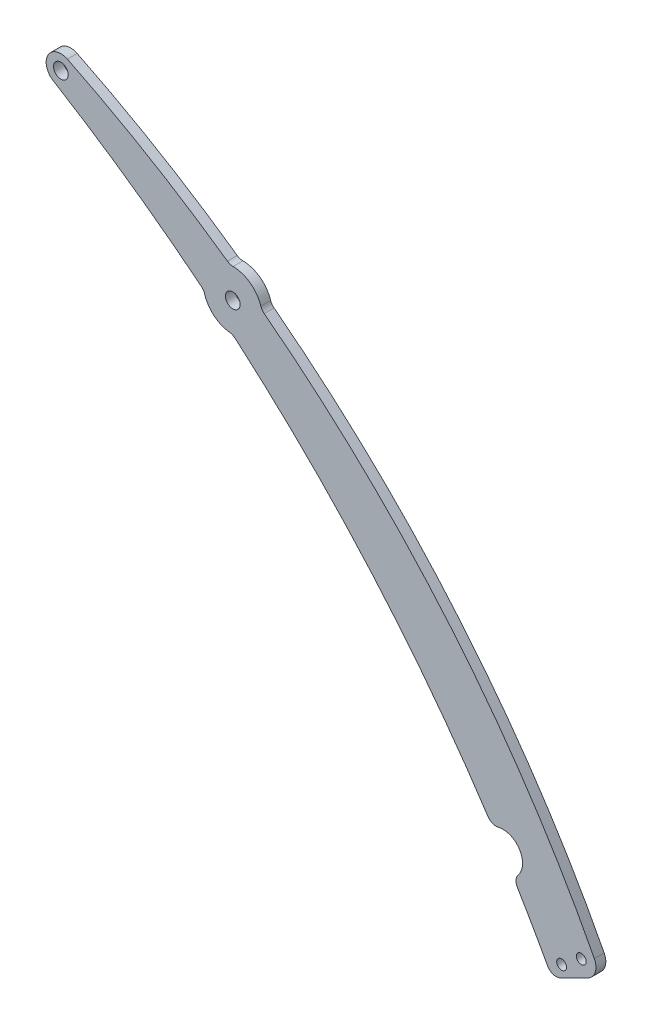
ISO-10303-21;
HEADER;
FILE_DESCRIPTION(('STEP AP214'),'2;1');
FILE_NAME('part.step','',(''),(''),'','','');
FILE_SCHEMA(('AUTOMOTIVE_DESIGN { 1 0 10303 214 1 1 1 1 }'));
ENDSEC;
DATA;
#1=APPLICATION_CONTEXT('core data for automotive mechanical design processes');
#2=APPLICATION_PROTOCOL_DEFINITION('international standard','automotive_design',2000,#1);
#3=PRODUCT_CONTEXT('',#1,'mechanical');
#4=PRODUCT('Part','Part','',(#3));
#5=PRODUCT_RELATED_PRODUCT_CATEGORY('part','',(#4));
#6=PRODUCT_DEFINITION_FORMATION('','',#4);
#7=PRODUCT_DEFINITION_CONTEXT('part definition',#1,'design');
#8=PRODUCT_DEFINITION('design','',#6,#7);
#9=PRODUCT_DEFINITION_SHAPE('','',#8);
#10=(LENGTH_UNIT() NAMED_UNIT(*) SI_UNIT(.MILLI.,.METRE.));
#11=(NAMED_UNIT(*) PLANE_ANGLE_UNIT() SI_UNIT($,.RADIAN.));
#12=(NAMED_UNIT(*) SI_UNIT($,.STERADIAN.) SOLID_ANGLE_UNIT());
#13=UNCERTAINTY_MEASURE_WITH_UNIT(LENGTH_MEASURE(1.E-05),#10,'distance_accuracy_value','');
#14=(GEOMETRIC_REPRESENTATION_CONTEXT(3) GLOBAL_UNCERTAINTY_ASSIGNED_CONTEXT((#13)) GLOBAL_UNIT_ASSIGNED_CONTEXT((#10,
#11,#12)) REPRESENTATION_CONTEXT('',''));
#15=CARTESIAN_POINT('',(0.,0.,0.));
#16=DIRECTION('',(0.,0.,1.));
#17=DIRECTION('',(1.,0.,0.));
#18=AXIS2_PLACEMENT_3D('',#15,#16,#17);
#19=CARTESIAN_POINT('',(-104.441646141028,-212.746192801075,2.));
#20=DIRECTION('',(0.,0.,-1.));
#21=DIRECTION('',(-1.,0.,0.));
#22=AXIS2_PLACEMENT_3D('',#19,#20,#21);
#23=PLANE('',#22);
#24=CARTESIAN_POINT('',(-104.441646141028,-212.746192801075,2.));
#25=DIRECTION('',(0.,0.,1.));
#26=DIRECTION('',(-1.,0.,0.));
#27=AXIS2_PLACEMENT_3D('',#24,#25,#26);
#28=CIRCLE('',#27,240.);
#29=CARTESIAN_POINT('',(33.906457746994,-16.6344844545589,2.));
#30=VERTEX_POINT('',#29);
#31=CARTESIAN_POINT('',(1.32204615368389,2.69298978229209,2.));
#32=VERTEX_POINT('',#31);
#33=EDGE_CURVE('E226',#30,#32,#28,.T.);
#34=ORIENTED_EDGE('',*,*,#33,.T.);
#35=CARTESIAN_POINT('',(0.,0.,2.));
#36=DIRECTION('',(0.,0.,1.));
#37=DIRECTION('',(1.,0.,0.));
#38=AXIS2_PLACEMENT_3D('',#35,#36,#37);
#39=CIRCLE('',#38,3.);
#40=CARTESIAN_POINT('',(-1.55871058061747,-2.56328330971649,2.));
#41=VERTEX_POINT('',#40);
#42=EDGE_CURVE('E124',#32,#41,#39,.T.);
#43=ORIENTED_EDGE('',*,*,#42,.T.);
#44=CARTESIAN_POINT('',(-147.038364771582,-241.803058883256,2.));
#45=DIRECTION('',(0.,0.,-1.));
#46=DIRECTION('',(-1.,0.,0.));
#47=AXIS2_PLACEMENT_3D('',#44,#45,#46);
#48=CIRCLE('',#47,280.);
#49=CARTESIAN_POINT('',(28.589143834394,-23.7320194927445,2.));
#50=VERTEX_POINT('',#49);
#51=EDGE_CURVE('E271',#41,#50,#48,.T.);
#52=ORIENTED_EDGE('',*,*,#51,.T.);
#53=CARTESIAN_POINT('',(27.3346616300656,-25.2896697741052,2.));
#54=DIRECTION('',(0.,0.,-1.));
#55=DIRECTION('',(-1.,0.,0.));
#56=AXIS2_PLACEMENT_3D('',#53,#54,#55);
#57=CIRCLE('',#56,2.);
#58=CARTESIAN_POINT('',(29.2509962225486,-24.7172523305791,2.));
#59=VERTEX_POINT('',#58);
#60=EDGE_CURVE('E290',#50,#59,#57,.T.);
#61=ORIENTED_EDGE('',*,*,#60,.T.);
#62=CARTESIAN_POINT('',(35.,-23.,2.));
#63=DIRECTION('',(0.,0.,1.));
#64=DIRECTION('',(1.,0.,0.));
#65=AXIS2_PLACEMENT_3D('',#62,#63,#64);
#66=CIRCLE('',#65,6.00000000000246);
#67=CARTESIAN_POINT('',(34.3571848035066,-28.9654663374448,2.));
#68=VERTEX_POINT('',#67);
#69=EDGE_CURVE('E287',#59,#68,#66,.T.);
#70=ORIENTED_EDGE('',*,*,#69,.T.);
#71=CARTESIAN_POINT('',(34.1429130713422,-30.9539551165922,2.));
#72=DIRECTION('',(0.,0.,-1.));
#73=DIRECTION('',(1.,0.,0.));
#74=AXIS2_PLACEMENT_3D('',#71,#72,#73);
#75=CIRCLE('',#74,2.);
#76=CARTESIAN_POINT('',(35.4463755018668,-29.4370550894939,2.));
#77=VERTEX_POINT('',#76);
#78=EDGE_CURVE('E289',#68,#77,#75,.T.);
#79=ORIENTED_EDGE('',*,*,#78,.T.);
#80=CARTESIAN_POINT('',(-147.038364771582,-241.803058883256,2.));
#81=DIRECTION('',(0.,0.,-1.));
#82=DIRECTION('',(-1.,0.,0.));
#83=AXIS2_PLACEMENT_3D('',#80,#81,#82);
#84=CIRCLE('',#83,280.);
#85=CARTESIAN_POINT('',(86.9517610214961,-88.0219773701524,2.));
#86=VERTEX_POINT('',#85);
#87=EDGE_CURVE('E292',#77,#86,#84,.T.);
#88=ORIENTED_EDGE('',*,*,#87,.T.);
#89=CARTESIAN_POINT('',(88.6231190628752,-86.9235410736303,2.));
#90=DIRECTION('',(0.,0.,1.));
#91=DIRECTION('',(-1.,0.,0.));
#92=AXIS2_PLACEMENT_3D('',#89,#90,#91);
#93=CIRCLE('',#92,2.);
#94=CARTESIAN_POINT('',(89.0820793752501,-88.8701677537271,2.));
#95=VERTEX_POINT('',#94);
#96=EDGE_CURVE('E298',#86,#95,#93,.T.);
#97=ORIENTED_EDGE('',*,*,#96,.T.);
#98=CARTESIAN_POINT('',(90.,-92.7634211139207,2.));
#99=DIRECTION('',(0.,0.,-1.));
#100=DIRECTION('',(-1.,0.,0.));
#101=AXIS2_PLACEMENT_3D('',#98,#99,#100);
#102=CIRCLE('',#101,3.99999999999999);
#103=CARTESIAN_POINT('',(93.1109286253578,-95.2778043559762,2.));
#104=VERTEX_POINT('',#103);
#105=EDGE_CURVE('E300',#95,#104,#102,.T.);
#106=ORIENTED_EDGE('',*,*,#105,.T.);
#107=CARTESIAN_POINT('',(94.6663929380367,-96.5349959770039,2.));
#108=DIRECTION('',(0.,0.,1.));
#109=DIRECTION('',(1.,0.,0.));
#110=AXIS2_PLACEMENT_3D('',#107,#108,#109);
#111=CIRCLE('',#110,2.);
#112=CARTESIAN_POINT('',(92.9521747982521,-97.5652659266937,2.));
#113=VERTEX_POINT('',#112);
#114=EDGE_CURVE('E302',#104,#113,#111,.T.);
#115=ORIENTED_EDGE('',*,*,#114,.T.);
#116=CARTESIAN_POINT('',(-147.038364771582,-241.803058883256,2.));
#117=DIRECTION('',(0.,0.,-1.));
#118=DIRECTION('',(-1.,0.,0.));
#119=AXIS2_PLACEMENT_3D('',#116,#117,#118);
#120=CIRCLE('',#119,280.);
#121=CARTESIAN_POINT('',(99.0817764541614,-108.293223728611,2.));
#122=VERTEX_POINT('',#121);
#123=EDGE_CURVE('E304',#113,#122,#120,.T.);
#124=ORIENTED_EDGE('',*,*,#123,.T.);
#125=CARTESIAN_POINT('',(100.839777462917,-107.339582048935,2.));
#126=DIRECTION('',(0.,0.,1.));
#127=DIRECTION('',(1.,0.,0.));
#128=AXIS2_PLACEMENT_3D('',#125,#126,#127);
#129=CIRCLE('',#128,1.99999999999999);
#130=CARTESIAN_POINT('',(101.737876551127,-109.126595766777,2.));
#131=VERTEX_POINT('',#130);
#132=EDGE_CURVE('E306',#122,#131,#129,.T.);
#133=ORIENTED_EDGE('',*,*,#132,.T.);
#134=DIRECTION('',(0.893506858920948,0.449049544105348,0.));
#135=VECTOR('',#134,1.);
#136=CARTESIAN_POINT('',(107.302513423485,-106.329977446844,2.));
#137=LINE('',#136,#135);
#138=CARTESIAN_POINT('',(107.302513423485,-106.329977446844,2.));
#139=VERTEX_POINT('',#138);
#140=EDGE_CURVE('E308',#131,#139,#137,.T.);
#141=ORIENTED_EDGE('',*,*,#140,.T.);
#142=CARTESIAN_POINT('',(105.955364791169,-103.649456870081,2.));
#143=DIRECTION('',(0.,0.,1.));
#144=DIRECTION('',(-1.,0.,0.));
#145=AXIS2_PLACEMENT_3D('',#142,#143,#144);
#146=CIRCLE('',#145,2.99999999999999);
#147=CARTESIAN_POINT('',(108.618618094108,-102.268485529183,2.));
#148=VERTEX_POINT('',#147);
#149=EDGE_CURVE('E310',#139,#148,#146,.T.);
#150=ORIENTED_EDGE('',*,*,#149,.T.);
#151=CARTESIAN_POINT('',(-104.441646141028,-212.746192801075,2.));
#152=DIRECTION('',(0.,0.,1.));
#153=DIRECTION('',(-1.,0.,0.));
#154=AXIS2_PLACEMENT_3D('',#151,#152,#153);
#155=CIRCLE('',#154,240.);
#156=CARTESIAN_POINT('',(41.4015934450764,-22.1425478542113,2.));
#157=VERTEX_POINT('',#156);
#158=EDGE_CURVE('E173',#148,#157,#155,.T.);
#159=ORIENTED_EDGE('',*,*,#158,.T.);
#160=CARTESIAN_POINT('',(42.6169537749606,-20.5541841463207,2.));
#161=DIRECTION('',(0.,0.,-1.));
#162=DIRECTION('',(-1.,0.,0.));
#163=AXIS2_PLACEMENT_3D('',#160,#161,#162);
#164=CIRCLE('',#163,2.);
#165=CARTESIAN_POINT('',(40.7127153312204,-21.1656381097406,2.));
#166=VERTEX_POINT('',#165);
#167=EDGE_CURVE('E167',#157,#166,#164,.T.);
#168=ORIENTED_EDGE('',*,*,#167,.T.);
#169=CARTESIAN_POINT('',(35.,-23.,2.));
#170=DIRECTION('',(0.,0.,1.));
#171=DIRECTION('',(1.,0.,0.));
#172=AXIS2_PLACEMENT_3D('',#169,#170,#171);
#173=CIRCLE('',#172,5.99999999999969);
#174=CARTESIAN_POINT('',(35.0445189595456,-17.0001651637535,2.));
#175=VERTEX_POINT('',#174);
#176=EDGE_CURVE('E171',#166,#175,#173,.T.);
#177=ORIENTED_EDGE('',*,*,#176,.T.);
#178=CARTESIAN_POINT('',(35.0593586127275,-15.0002202183379,2.));
#179=DIRECTION('',(0.,0.,-1.));
#180=DIRECTION('',(1.,0.,0.));
#181=AXIS2_PLACEMENT_3D('',#178,#179,#180);
#182=CIRCLE('',#181,2.);
#183=EDGE_CURVE('E51',#175,#30,#182,.T.);
#184=ORIENTED_EDGE('',*,*,#183,.T.);
#185=EDGE_LOOP('',(#34,#43,#52,#61,#70,#79,#88,#97,#106,#115,#124,#133,#141,#150,#159,#168,#177,#184));
#186=FACE_BOUND('',#185,.T.);
#187=CARTESIAN_POINT('',(0.,0.,2.));
#188=DIRECTION('',(0.,0.,1.));
#189=DIRECTION('',(1.,0.,0.));
#190=AXIS2_PLACEMENT_3D('',#187,#188,#189);
#191=CIRCLE('',#190,1.5);
#192=CARTESIAN_POINT('',(1.5,0.,2.));
#193=VERTEX_POINT('',#192);
#194=EDGE_CURVE('E195',#193,#193,#191,.T.);
#195=ORIENTED_EDGE('',*,*,#194,.F.);
#196=EDGE_LOOP('',(#195));
#197=FACE_BOUND('',#196,.T.);
#198=CARTESIAN_POINT('',(101.955364791169,-106.649456870081,2.));
#199=DIRECTION('',(0.,0.,1.));
#200=DIRECTION('',(1.,0.,0.));
#201=AXIS2_PLACEMENT_3D('',#198,#199,#200);
#202=CIRCLE('',#201,0.999999999999998);
#203=CARTESIAN_POINT('',(102.955364791169,-106.649456870081,2.));
#204=VERTEX_POINT('',#203);
#205=EDGE_CURVE('E374',#204,#204,#202,.T.);
#206=ORIENTED_EDGE('',*,*,#205,.F.);
#207=EDGE_LOOP('',(#206));
#208=FACE_BOUND('',#207,.T.);
#209=CARTESIAN_POINT('',(35.,-23.,2.));
#210=DIRECTION('',(0.,0.,1.));
#211=DIRECTION('',(1.,0.,0.));
#212=AXIS2_PLACEMENT_3D('',#209,#210,#211);
#213=CIRCLE('',#212,1.5);
#214=CARTESIAN_POINT('',(36.5,-23.,2.));
#215=VERTEX_POINT('',#214);
#216=EDGE_CURVE('E368',#215,#215,#213,.T.);
#217=ORIENTED_EDGE('',*,*,#216,.F.);
#218=EDGE_LOOP('',(#217));
#219=FACE_BOUND('',#218,.T.);
#220=CARTESIAN_POINT('',(105.955364791169,-103.649456870081,2.));
#221=DIRECTION('',(0.,0.,1.));
#222=DIRECTION('',(1.,0.,0.));
#223=AXIS2_PLACEMENT_3D('',#220,#221,#222);
#224=CIRCLE('',#223,0.999999999999998);
#225=CARTESIAN_POINT('',(106.955364791169,-103.649456870081,2.));
#226=VERTEX_POINT('',#225);
#227=EDGE_CURVE('E359',#226,#226,#224,.T.);
#228=ORIENTED_EDGE('',*,*,#227,.F.);
#229=EDGE_LOOP('',(#228));
#230=FACE_BOUND('',#229,.T.);
#231=ADVANCED_FACE('F34',(#186,#197,#208,#219,#230),#23,.F.);
#232=CARTESIAN_POINT('',(-104.441646141028,-212.746192801075,0.));
#233=DIRECTION('',(0.,0.,-1.));
#234=DIRECTION('',(-1.,0.,0.));
#235=AXIS2_PLACEMENT_3D('',#232,#233,#234);
#236=PLANE('',#235);
#237=CARTESIAN_POINT('',(35.,-23.,0.));
#238=DIRECTION('',(0.,0.,1.));
#239=DIRECTION('',(1.,0.,0.));
#240=AXIS2_PLACEMENT_3D('',#237,#238,#239);
#241=CIRCLE('',#240,1.5);
#242=CARTESIAN_POINT('',(36.5,-23.,0.));
#243=VERTEX_POINT('',#242);
#244=EDGE_CURVE('E365',#243,#243,#241,.T.);
#245=ORIENTED_EDGE('',*,*,#244,.T.);
#246=EDGE_LOOP('',(#245));
#247=FACE_BOUND('',#246,.T.);
#248=CARTESIAN_POINT('',(0.,0.,0.));
#249=DIRECTION('',(0.,0.,1.));
#250=DIRECTION('',(1.,0.,0.));
#251=AXIS2_PLACEMENT_3D('',#248,#249,#250);
#252=CIRCLE('',#251,1.5);
#253=CARTESIAN_POINT('',(1.5,0.,0.));
#254=VERTEX_POINT('',#253);
#255=EDGE_CURVE('E377',#254,#254,#252,.T.);
#256=ORIENTED_EDGE('',*,*,#255,.T.);
#257=EDGE_LOOP('',(#256));
#258=FACE_BOUND('',#257,.T.);
#259=CARTESIAN_POINT('',(-104.441646141028,-212.746192801075,0.));
#260=DIRECTION('',(0.,0.,1.));
#261=DIRECTION('',(-1.,0.,0.));
#262=AXIS2_PLACEMENT_3D('',#259,#260,#261);
#263=CIRCLE('',#262,240.);
#264=CARTESIAN_POINT('',(33.906457746994,-16.6344844545589,0.));
#265=VERTEX_POINT('',#264);
#266=CARTESIAN_POINT('',(1.32204615368389,2.69298978229209,0.));
#267=VERTEX_POINT('',#266);
#268=EDGE_CURVE('E191',#265,#267,#263,.T.);
#269=ORIENTED_EDGE('',*,*,#268,.F.);
#270=CARTESIAN_POINT('',(35.0593586127275,-15.0002202183379,0.));
#271=DIRECTION('',(0.,0.,-1.));
#272=DIRECTION('',(1.,0.,0.));
#273=AXIS2_PLACEMENT_3D('',#270,#271,#272);
#274=CIRCLE('',#273,2.);
#275=CARTESIAN_POINT('',(35.0445189595456,-17.0001651637535,0.));
#276=VERTEX_POINT('',#275);
#277=EDGE_CURVE('E116',#276,#265,#274,.T.);
#278=ORIENTED_EDGE('',*,*,#277,.F.);
#279=CARTESIAN_POINT('',(35.,-23.,0.));
#280=DIRECTION('',(0.,0.,1.));
#281=DIRECTION('',(1.,0.,0.));
#282=AXIS2_PLACEMENT_3D('',#279,#280,#281);
#283=CIRCLE('',#282,5.99999999999969);
#284=CARTESIAN_POINT('',(40.7127153312204,-21.1656381097406,0.));
#285=VERTEX_POINT('',#284);
#286=EDGE_CURVE('E110',#285,#276,#283,.T.);
#287=ORIENTED_EDGE('',*,*,#286,.F.);
#288=CARTESIAN_POINT('',(42.6169537749606,-20.5541841463207,0.));
#289=DIRECTION('',(0.,0.,-1.));
#290=DIRECTION('',(-1.,0.,0.));
#291=AXIS2_PLACEMENT_3D('',#288,#289,#290);
#292=CIRCLE('',#291,2.);
#293=CARTESIAN_POINT('',(41.4015934450764,-22.1425478542113,0.));
#294=VERTEX_POINT('',#293);
#295=EDGE_CURVE('E181',#294,#285,#292,.T.);
#296=ORIENTED_EDGE('',*,*,#295,.F.);
#297=CARTESIAN_POINT('',(-104.441646141028,-212.746192801075,0.));
#298=DIRECTION('',(0.,0.,1.));
#299=DIRECTION('',(-1.,0.,0.));
#300=AXIS2_PLACEMENT_3D('',#297,#298,#299);
#301=CIRCLE('',#300,240.);
#302=CARTESIAN_POINT('',(108.618618094108,-102.268485529183,0.));
#303=VERTEX_POINT('',#302);
#304=EDGE_CURVE('E221',#303,#294,#301,.T.);
#305=ORIENTED_EDGE('',*,*,#304,.F.);
#306=CARTESIAN_POINT('',(105.955364791169,-103.649456870081,0.));
#307=DIRECTION('',(0.,0.,1.));
#308=DIRECTION('',(-1.,0.,0.));
#309=AXIS2_PLACEMENT_3D('',#306,#307,#308);
#310=CIRCLE('',#309,2.99999999999999);
#311=CARTESIAN_POINT('',(107.302513423485,-106.329977446844,0.));
#312=VERTEX_POINT('',#311);
#313=EDGE_CURVE('E219',#312,#303,#310,.T.);
#314=ORIENTED_EDGE('',*,*,#313,.F.);
#315=DIRECTION('',(0.893506858920948,0.449049544105348,0.));
#316=VECTOR('',#315,1.);
#317=CARTESIAN_POINT('',(107.302513423485,-106.329977446844,0.));
#318=LINE('',#317,#316);
#319=CARTESIAN_POINT('',(101.737876551127,-109.126595766777,0.));
#320=VERTEX_POINT('',#319);
#321=EDGE_CURVE('E217',#320,#312,#318,.T.);
#322=ORIENTED_EDGE('',*,*,#321,.F.);
#323=CARTESIAN_POINT('',(100.839777462917,-107.339582048935,0.));
#324=DIRECTION('',(0.,0.,1.));
#325=DIRECTION('',(1.,0.,0.));
#326=AXIS2_PLACEMENT_3D('',#323,#324,#325);
#327=CIRCLE('',#326,1.99999999999999);
#328=CARTESIAN_POINT('',(99.0817764541614,-108.293223728611,0.));
#329=VERTEX_POINT('',#328);
#330=EDGE_CURVE('E215',#329,#320,#327,.T.);
#331=ORIENTED_EDGE('',*,*,#330,.F.);
#332=CARTESIAN_POINT('',(-147.038364771582,-241.803058883256,0.));
#333=DIRECTION('',(0.,0.,-1.));
#334=DIRECTION('',(-1.,0.,0.));
#335=AXIS2_PLACEMENT_3D('',#332,#333,#334);
#336=CIRCLE('',#335,280.);
#337=CARTESIAN_POINT('',(92.9521747982521,-97.5652659266937,0.));
#338=VERTEX_POINT('',#337);
#339=EDGE_CURVE('E213',#338,#329,#336,.T.);
#340=ORIENTED_EDGE('',*,*,#339,.F.);
#341=CARTESIAN_POINT('',(94.6663929380367,-96.5349959770039,0.));
#342=DIRECTION('',(0.,0.,1.));
#343=DIRECTION('',(1.,0.,0.));
#344=AXIS2_PLACEMENT_3D('',#341,#342,#343);
#345=CIRCLE('',#344,2.);
#346=CARTESIAN_POINT('',(93.1109286253578,-95.2778043559762,0.));
#347=VERTEX_POINT('',#346);
#348=EDGE_CURVE('E211',#347,#338,#345,.T.);
#349=ORIENTED_EDGE('',*,*,#348,.F.);
#350=CARTESIAN_POINT('',(90.,-92.7634211139207,0.));
#351=DIRECTION('',(0.,0.,-1.));
#352=DIRECTION('',(-1.,0.,0.));
#353=AXIS2_PLACEMENT_3D('',#350,#351,#352);
#354=CIRCLE('',#353,3.99999999999999);
#355=CARTESIAN_POINT('',(89.0820793752501,-88.8701677537271,0.));
#356=VERTEX_POINT('',#355);
#357=EDGE_CURVE('E209',#356,#347,#354,.T.);
#358=ORIENTED_EDGE('',*,*,#357,.F.);
#359=CARTESIAN_POINT('',(88.6231190628752,-86.9235410736303,0.));
#360=DIRECTION('',(0.,0.,1.));
#361=DIRECTION('',(-1.,0.,0.));
#362=AXIS2_PLACEMENT_3D('',#359,#360,#361);
#363=CIRCLE('',#362,2.);
#364=CARTESIAN_POINT('',(86.9517610214961,-88.0219773701524,0.));
#365=VERTEX_POINT('',#364);
#366=EDGE_CURVE('E207',#365,#356,#363,.T.);
#367=ORIENTED_EDGE('',*,*,#366,.F.);
#368=CARTESIAN_POINT('',(-147.038364771582,-241.803058883256,0.));
#369=DIRECTION('',(0.,0.,-1.));
#370=DIRECTION('',(-1.,0.,0.));
#371=AXIS2_PLACEMENT_3D('',#368,#369,#370);
#372=CIRCLE('',#371,280.);
#373=CARTESIAN_POINT('',(35.4463755018668,-29.4370550894939,0.));
#374=VERTEX_POINT('',#373);
#375=EDGE_CURVE('E205',#374,#365,#372,.T.);
#376=ORIENTED_EDGE('',*,*,#375,.F.);
#377=CARTESIAN_POINT('',(34.1429130713422,-30.9539551165922,0.));
#378=DIRECTION('',(0.,0.,-1.));
#379=DIRECTION('',(1.,0.,0.));
#380=AXIS2_PLACEMENT_3D('',#377,#378,#379);
#381=CIRCLE('',#380,2.);
#382=CARTESIAN_POINT('',(34.3571848035066,-28.9654663374448,0.));
#383=VERTEX_POINT('',#382);
#384=EDGE_CURVE('E203',#383,#374,#381,.T.);
#385=ORIENTED_EDGE('',*,*,#384,.F.);
#386=CARTESIAN_POINT('',(35.,-23.,0.));
#387=DIRECTION('',(0.,0.,1.));
#388=DIRECTION('',(1.,0.,0.));
#389=AXIS2_PLACEMENT_3D('',#386,#387,#388);
#390=CIRCLE('',#389,6.00000000000246);
#391=CARTESIAN_POINT('',(29.2509962225486,-24.7172523305791,0.));
#392=VERTEX_POINT('',#391);
#393=EDGE_CURVE('E201',#392,#383,#390,.T.);
#394=ORIENTED_EDGE('',*,*,#393,.F.);
#395=CARTESIAN_POINT('',(27.3346616300656,-25.2896697741052,0.));
#396=DIRECTION('',(0.,0.,-1.));
#397=DIRECTION('',(-1.,0.,0.));
#398=AXIS2_PLACEMENT_3D('',#395,#396,#397);
#399=CIRCLE('',#398,2.);
#400=CARTESIAN_POINT('',(28.589143834394,-23.7320194927445,0.));
#401=VERTEX_POINT('',#400);
#402=EDGE_CURVE('E199',#401,#392,#399,.T.);
#403=ORIENTED_EDGE('',*,*,#402,.F.);
#404=CARTESIAN_POINT('',(-147.038364771582,-241.803058883256,0.));
#405=DIRECTION('',(0.,0.,-1.));
#406=DIRECTION('',(-1.,0.,0.));
#407=AXIS2_PLACEMENT_3D('',#404,#405,#406);
#408=CIRCLE('',#407,280.);
#409=CARTESIAN_POINT('',(-1.55871058061747,-2.56328330971649,0.));
#410=VERTEX_POINT('',#409);
#411=EDGE_CURVE('E197',#410,#401,#408,.T.);
#412=ORIENTED_EDGE('',*,*,#411,.F.);
#413=CARTESIAN_POINT('',(0.,0.,0.));
#414=DIRECTION('',(0.,0.,1.));
#415=DIRECTION('',(1.,0.,0.));
#416=AXIS2_PLACEMENT_3D('',#413,#414,#415);
#417=CIRCLE('',#416,3.);
#418=EDGE_CURVE('E194',#267,#410,#417,.T.);
#419=ORIENTED_EDGE('',*,*,#418,.F.);
#420=EDGE_LOOP('',(#269,#278,#287,#296,#305,#314,#322,#331,#340,#349,#358,#367,#376,#385,#394,
#403,#412,#419));
#421=FACE_BOUND('',#420,.T.);
#422=CARTESIAN_POINT('',(101.955364791169,-106.649456870081,0.));
#423=DIRECTION('',(0.,0.,1.));
#424=DIRECTION('',(1.,0.,0.));
#425=AXIS2_PLACEMENT_3D('',#422,#423,#424);
#426=CIRCLE('',#425,0.999999999999998);
#427=CARTESIAN_POINT('',(102.955364791169,-106.649456870081,0.));
#428=VERTEX_POINT('',#427);
#429=EDGE_CURVE('E371',#428,#428,#426,.T.);
#430=ORIENTED_EDGE('',*,*,#429,.T.);
#431=EDGE_LOOP('',(#430));
#432=FACE_BOUND('',#431,.T.);
#433=CARTESIAN_POINT('',(105.955364791169,-103.649456870081,0.));
#434=DIRECTION('',(0.,0.,1.));
#435=DIRECTION('',(1.,0.,0.));
#436=AXIS2_PLACEMENT_3D('',#433,#434,#435);
#437=CIRCLE('',#436,0.999999999999998);
#438=CARTESIAN_POINT('',(106.955364791169,-103.649456870081,0.));
#439=VERTEX_POINT('',#438);
#440=EDGE_CURVE('E362',#439,#439,#437,.T.);
#441=ORIENTED_EDGE('',*,*,#440,.T.);
#442=EDGE_LOOP('',(#441));
#443=FACE_BOUND('',#442,.T.);
#444=ADVANCED_FACE('F275',(#247,#258,#421,#432,#443),#236,.T.);
#445=CARTESIAN_POINT('',(-104.441646141028,-212.746192801075,2.));
#446=DIRECTION('',(0.,0.,-1.));
#447=DIRECTION('',(-1.,0.,0.));
#448=AXIS2_PLACEMENT_3D('',#445,#446,#447);
#449=CYLINDRICAL_SURFACE('',#448,240.);
#450=ORIENTED_EDGE('',*,*,#268,.T.);
#451=DIRECTION('',(0.,0.,-1.));
#452=VECTOR('',#451,1.);
#453=CARTESIAN_POINT('',(1.32204615368389,2.69298978229209,2.));
#454=LINE('',#453,#452);
#455=EDGE_CURVE('E11',#32,#267,#454,.T.);
#456=ORIENTED_EDGE('',*,*,#455,.F.);
#457=ORIENTED_EDGE('',*,*,#33,.F.);
#458=DIRECTION('',(0.,0.,-1.));
#459=VECTOR('',#458,1.);
#460=CARTESIAN_POINT('',(33.906457746994,-16.6344844545589,2.));
#461=LINE('',#460,#459);
#462=EDGE_CURVE('E187',#30,#265,#461,.T.);
#463=ORIENTED_EDGE('',*,*,#462,.T.);
#464=EDGE_LOOP('',(#450,#456,#457,#463));
#465=FACE_BOUND('',#464,.T.);
#466=ADVANCED_FACE('F36',(#465),#449,.T.);
#467=CARTESIAN_POINT('',(0.,0.,2.));
#468=DIRECTION('',(0.,0.,-1.));
#469=DIRECTION('',(-1.,0.,0.));
#470=AXIS2_PLACEMENT_3D('',#467,#468,#469);
#471=CYLINDRICAL_SURFACE('',#470,3.);
#472=ORIENTED_EDGE('',*,*,#418,.T.);
#473=DIRECTION('',(0.,0.,-1.));
#474=VECTOR('',#473,1.);
#475=CARTESIAN_POINT('',(-1.55871058061747,-2.56328330971649,2.));
#476=LINE('',#475,#474);
#477=EDGE_CURVE('E43',#41,#410,#476,.T.);
#478=ORIENTED_EDGE('',*,*,#477,.F.);
#479=ORIENTED_EDGE('',*,*,#42,.F.);
#480=ORIENTED_EDGE('',*,*,#455,.T.);
#481=EDGE_LOOP('',(#472,#478,#479,#480));
#482=FACE_BOUND('',#481,.T.);
#483=ADVANCED_FACE('F549',(#482),#471,.T.);
#484=CARTESIAN_POINT('',(-147.038364771582,-241.803058883256,2.));
#485=DIRECTION('',(0.,0.,-1.));
#486=DIRECTION('',(-1.,0.,0.));
#487=AXIS2_PLACEMENT_3D('',#484,#485,#486);
#488=CYLINDRICAL_SURFACE('',#487,280.);
#489=ORIENTED_EDGE('',*,*,#411,.T.);
#490=DIRECTION('',(0.,0.,-1.));
#491=VECTOR('',#490,1.);
#492=CARTESIAN_POINT('',(28.589143834394,-23.7320194927445,2.));
#493=LINE('',#492,#491);
#494=EDGE_CURVE('E263',#50,#401,#493,.T.);
#495=ORIENTED_EDGE('',*,*,#494,.F.);
#496=ORIENTED_EDGE('',*,*,#51,.F.);
#497=ORIENTED_EDGE('',*,*,#477,.T.);
#498=EDGE_LOOP('',(#489,#495,#496,#497));
#499=FACE_BOUND('',#498,.T.);
#500=ADVANCED_FACE('F269',(#499),#488,.F.);
#501=CARTESIAN_POINT('',(27.3346616300656,-25.2896697741052,2.));
#502=DIRECTION('',(0.,0.,-1.));
#503=DIRECTION('',(-1.,0.,0.));
#504=AXIS2_PLACEMENT_3D('',#501,#502,#503);
#505=CYLINDRICAL_SURFACE('',#504,2.);
#506=ORIENTED_EDGE('',*,*,#402,.T.);
#507=DIRECTION('',(0.,0.,-1.));
#508=VECTOR('',#507,1.);
#509=CARTESIAN_POINT('',(29.2509962225486,-24.7172523305791,2.));
#510=LINE('',#509,#508);
#511=EDGE_CURVE('E260',#59,#392,#510,.T.);
#512=ORIENTED_EDGE('',*,*,#511,.F.);
#513=ORIENTED_EDGE('',*,*,#60,.F.);
#514=ORIENTED_EDGE('',*,*,#494,.T.);
#515=EDGE_LOOP('',(#506,#512,#513,#514));
#516=FACE_BOUND('',#515,.T.);
#517=ADVANCED_FACE('F281',(#516),#505,.F.);
#518=CARTESIAN_POINT('',(35.,-23.,2.));
#519=DIRECTION('',(0.,0.,-1.));
#520=DIRECTION('',(-1.,0.,0.));
#521=AXIS2_PLACEMENT_3D('',#518,#519,#520);
#522=CYLINDRICAL_SURFACE('',#521,6.00000000000246);
#523=ORIENTED_EDGE('',*,*,#393,.T.);
#524=DIRECTION('',(0.,0.,-1.));
#525=VECTOR('',#524,1.);
#526=CARTESIAN_POINT('',(34.3571848035066,-28.9654663374448,2.));
#527=LINE('',#526,#525);
#528=EDGE_CURVE('E257',#68,#383,#527,.T.);
#529=ORIENTED_EDGE('',*,*,#528,.F.);
#530=ORIENTED_EDGE('',*,*,#69,.F.);
#531=ORIENTED_EDGE('',*,*,#511,.T.);
#532=EDGE_LOOP('',(#523,#529,#530,#531));
#533=FACE_BOUND('',#532,.T.);
#534=ADVANCED_FACE('F285',(#533),#522,.T.);
#535=CARTESIAN_POINT('',(34.1429130713422,-30.9539551165922,2.));
#536=DIRECTION('',(0.,0.,-1.));
#537=DIRECTION('',(-1.,0.,0.));
#538=AXIS2_PLACEMENT_3D('',#535,#536,#537);
#539=CYLINDRICAL_SURFACE('',#538,2.);
#540=ORIENTED_EDGE('',*,*,#384,.T.);
#541=DIRECTION('',(0.,0.,-1.));
#542=VECTOR('',#541,1.);
#543=CARTESIAN_POINT('',(35.4463755018668,-29.4370550894939,2.));
#544=LINE('',#543,#542);
#545=EDGE_CURVE('E254',#77,#374,#544,.T.);
#546=ORIENTED_EDGE('',*,*,#545,.F.);
#547=ORIENTED_EDGE('',*,*,#78,.F.);
#548=ORIENTED_EDGE('',*,*,#528,.T.);
#549=EDGE_LOOP('',(#540,#546,#547,#548));
#550=FACE_BOUND('',#549,.T.);
#551=ADVANCED_FACE('F514',(#550),#539,.F.);
#552=CARTESIAN_POINT('',(-147.038364771582,-241.803058883256,2.));
#553=DIRECTION('',(0.,0.,-1.));
#554=DIRECTION('',(-1.,0.,0.));
#555=AXIS2_PLACEMENT_3D('',#552,#553,#554);
#556=CYLINDRICAL_SURFACE('',#555,280.);
#557=ORIENTED_EDGE('',*,*,#375,.T.);
#558=DIRECTION('',(0.,0.,-1.));
#559=VECTOR('',#558,1.);
#560=CARTESIAN_POINT('',(86.9517610214961,-88.0219773701524,2.));
#561=LINE('',#560,#559);
#562=EDGE_CURVE('E251',#86,#365,#561,.T.);
#563=ORIENTED_EDGE('',*,*,#562,.F.);
#564=ORIENTED_EDGE('',*,*,#87,.F.);
#565=ORIENTED_EDGE('',*,*,#545,.T.);
#566=EDGE_LOOP('',(#557,#563,#564,#565));
#567=FACE_BOUND('',#566,.T.);
#568=ADVANCED_FACE('F504',(#567),#556,.F.);
#569=CARTESIAN_POINT('',(88.6231190628752,-86.9235410736303,2.));
#570=DIRECTION('',(0.,0.,-1.));
#571=DIRECTION('',(-1.,0.,0.));
#572=AXIS2_PLACEMENT_3D('',#569,#570,#571);
#573=CYLINDRICAL_SURFACE('',#572,2.);
#574=ORIENTED_EDGE('',*,*,#366,.T.);
#575=DIRECTION('',(0.,0.,-1.));
#576=VECTOR('',#575,1.);
#577=CARTESIAN_POINT('',(89.0820793752501,-88.8701677537271,2.));
#578=LINE('',#577,#576);
#579=EDGE_CURVE('E248',#95,#356,#578,.T.);
#580=ORIENTED_EDGE('',*,*,#579,.F.);
#581=ORIENTED_EDGE('',*,*,#96,.F.);
#582=ORIENTED_EDGE('',*,*,#562,.T.);
#583=EDGE_LOOP('',(#574,#580,#581,#582));
#584=FACE_BOUND('',#583,.T.);
#585=ADVANCED_FACE('F494',(#584),#573,.T.);
#586=CARTESIAN_POINT('',(90.,-92.7634211139207,2.));
#587=DIRECTION('',(0.,0.,-1.));
#588=DIRECTION('',(-1.,0.,0.));
#589=AXIS2_PLACEMENT_3D('',#586,#587,#588);
#590=CYLINDRICAL_SURFACE('',#589,3.99999999999999);
#591=ORIENTED_EDGE('',*,*,#357,.T.);
#592=DIRECTION('',(0.,0.,-1.));
#593=VECTOR('',#592,1.);
#594=CARTESIAN_POINT('',(93.1109286253578,-95.2778043559762,2.));
#595=LINE('',#594,#593);
#596=EDGE_CURVE('E245',#104,#347,#595,.T.);
#597=ORIENTED_EDGE('',*,*,#596,.F.);
#598=ORIENTED_EDGE('',*,*,#105,.F.);
#599=ORIENTED_EDGE('',*,*,#579,.T.);
#600=EDGE_LOOP('',(#591,#597,#598,#599));
#601=FACE_BOUND('',#600,.T.);
#602=ADVANCED_FACE('F484',(#601),#590,.F.);
#603=CARTESIAN_POINT('',(94.6663929380367,-96.5349959770039,2.));
#604=DIRECTION('',(0.,0.,-1.));
#605=DIRECTION('',(-1.,0.,0.));
#606=AXIS2_PLACEMENT_3D('',#603,#604,#605);
#607=CYLINDRICAL_SURFACE('',#606,2.);
#608=ORIENTED_EDGE('',*,*,#348,.T.);
#609=DIRECTION('',(0.,0.,-1.));
#610=VECTOR('',#609,1.);
#611=CARTESIAN_POINT('',(92.9521747982521,-97.5652659266937,2.));
#612=LINE('',#611,#610);
#613=EDGE_CURVE('E242',#113,#338,#612,.T.);
#614=ORIENTED_EDGE('',*,*,#613,.F.);
#615=ORIENTED_EDGE('',*,*,#114,.F.);
#616=ORIENTED_EDGE('',*,*,#596,.T.);
#617=EDGE_LOOP('',(#608,#614,#615,#616));
#618=FACE_BOUND('',#617,.T.);
#619=ADVANCED_FACE('F474',(#618),#607,.T.);
#620=CARTESIAN_POINT('',(-147.038364771582,-241.803058883256,2.));
#621=DIRECTION('',(0.,0.,-1.));
#622=DIRECTION('',(-1.,0.,0.));
#623=AXIS2_PLACEMENT_3D('',#620,#621,#622);
#624=CYLINDRICAL_SURFACE('',#623,280.);
#625=ORIENTED_EDGE('',*,*,#339,.T.);
#626=DIRECTION('',(0.,0.,-1.));
#627=VECTOR('',#626,1.);
#628=CARTESIAN_POINT('',(99.0817764541614,-108.293223728611,2.));
#629=LINE('',#628,#627);
#630=EDGE_CURVE('E239',#122,#329,#629,.T.);
#631=ORIENTED_EDGE('',*,*,#630,.F.);
#632=ORIENTED_EDGE('',*,*,#123,.F.);
#633=ORIENTED_EDGE('',*,*,#613,.T.);
#634=EDGE_LOOP('',(#625,#631,#632,#633));
#635=FACE_BOUND('',#634,.T.);
#636=ADVANCED_FACE('F464',(#635),#624,.F.);
#637=CARTESIAN_POINT('',(100.839777462917,-107.339582048935,2.));
#638=DIRECTION('',(0.,0.,-1.));
#639=DIRECTION('',(-1.,0.,0.));
#640=AXIS2_PLACEMENT_3D('',#637,#638,#639);
#641=CYLINDRICAL_SURFACE('',#640,1.99999999999999);
#642=ORIENTED_EDGE('',*,*,#330,.T.);
#643=DIRECTION('',(0.,0.,-1.));
#644=VECTOR('',#643,1.);
#645=CARTESIAN_POINT('',(101.737876551127,-109.126595766777,2.));
#646=LINE('',#645,#644);
#647=EDGE_CURVE('E236',#131,#320,#646,.T.);
#648=ORIENTED_EDGE('',*,*,#647,.F.);
#649=ORIENTED_EDGE('',*,*,#132,.F.);
#650=ORIENTED_EDGE('',*,*,#630,.T.);
#651=EDGE_LOOP('',(#642,#648,#649,#650));
#652=FACE_BOUND('',#651,.T.);
#653=ADVANCED_FACE('F454',(#652),#641,.T.);
#654=CARTESIAN_POINT('',(107.302513423485,-106.329977446844,2.));
#655=DIRECTION('',(-0.449049544105348,0.893506858920948,0.));
#656=DIRECTION('',(-0.893506858920948,-0.449049544105348,0.));
#657=AXIS2_PLACEMENT_3D('',#654,#655,#656);
#658=PLANE('',#657);
#659=ORIENTED_EDGE('',*,*,#321,.T.);
#660=DIRECTION('',(0.,0.,-1.));
#661=VECTOR('',#660,1.);
#662=CARTESIAN_POINT('',(107.302513423485,-106.329977446844,2.));
#663=LINE('',#662,#661);
#664=EDGE_CURVE('E233',#139,#312,#663,.T.);
#665=ORIENTED_EDGE('',*,*,#664,.F.);
#666=ORIENTED_EDGE('',*,*,#140,.F.);
#667=ORIENTED_EDGE('',*,*,#647,.T.);
#668=EDGE_LOOP('',(#659,#665,#666,#667));
#669=FACE_BOUND('',#668,.T.);
#670=ADVANCED_FACE('F445',(#669),#658,.F.);
#671=CARTESIAN_POINT('',(105.955364791169,-103.649456870081,2.));
#672=DIRECTION('',(0.,0.,-1.));
#673=DIRECTION('',(-1.,0.,0.));
#674=AXIS2_PLACEMENT_3D('',#671,#672,#673);
#675=CYLINDRICAL_SURFACE('',#674,2.99999999999999);
#676=ORIENTED_EDGE('',*,*,#313,.T.);
#677=DIRECTION('',(0.,0.,-1.));
#678=VECTOR('',#677,1.);
#679=CARTESIAN_POINT('',(108.618618094108,-102.268485529183,2.));
#680=LINE('',#679,#678);
#681=EDGE_CURVE('E230',#148,#303,#680,.T.);
#682=ORIENTED_EDGE('',*,*,#681,.F.);
#683=ORIENTED_EDGE('',*,*,#149,.F.);
#684=ORIENTED_EDGE('',*,*,#664,.T.);
#685=EDGE_LOOP('',(#676,#682,#683,#684));
#686=FACE_BOUND('',#685,.T.);
#687=ADVANCED_FACE('F316',(#686),#675,.T.);
#688=CARTESIAN_POINT('',(-104.441646141028,-212.746192801075,2.));
#689=DIRECTION('',(0.,0.,-1.));
#690=DIRECTION('',(-1.,0.,0.));
#691=AXIS2_PLACEMENT_3D('',#688,#689,#690);
#692=CYLINDRICAL_SURFACE('',#691,240.);
#693=ORIENTED_EDGE('',*,*,#304,.T.);
#694=DIRECTION('',(0.,0.,-1.));
#695=VECTOR('',#694,1.);
#696=CARTESIAN_POINT('',(41.4015934450764,-22.1425478542113,2.));
#697=LINE('',#696,#695);
#698=EDGE_CURVE('E182',#157,#294,#697,.T.);
#699=ORIENTED_EDGE('',*,*,#698,.F.);
#700=ORIENTED_EDGE('',*,*,#158,.F.);
#701=ORIENTED_EDGE('',*,*,#681,.T.);
#702=EDGE_LOOP('',(#693,#699,#700,#701));
#703=FACE_BOUND('',#702,.T.);
#704=ADVANCED_FACE('F320',(#703),#692,.T.);
#705=CARTESIAN_POINT('',(42.6169537749606,-20.5541841463207,2.));
#706=DIRECTION('',(0.,0.,-1.));
#707=DIRECTION('',(-1.,0.,0.));
#708=AXIS2_PLACEMENT_3D('',#705,#706,#707);
#709=CYLINDRICAL_SURFACE('',#708,2.);
#710=ORIENTED_EDGE('',*,*,#295,.T.);
#711=DIRECTION('',(0.,0.,-1.));
#712=VECTOR('',#711,1.);
#713=CARTESIAN_POINT('',(40.7127153312204,-21.1656381097406,2.));
#714=LINE('',#713,#712);
#715=EDGE_CURVE('E178',#166,#285,#714,.T.);
#716=ORIENTED_EDGE('',*,*,#715,.F.);
#717=ORIENTED_EDGE('',*,*,#167,.F.);
#718=ORIENTED_EDGE('',*,*,#698,.T.);
#719=EDGE_LOOP('',(#710,#716,#717,#718));
#720=FACE_BOUND('',#719,.T.);
#721=ADVANCED_FACE('F179',(#720),#709,.F.);
#722=CARTESIAN_POINT('',(35.,-23.,2.));
#723=DIRECTION('',(0.,0.,-1.));
#724=DIRECTION('',(-1.,0.,0.));
#725=AXIS2_PLACEMENT_3D('',#722,#723,#724);
#726=CYLINDRICAL_SURFACE('',#725,5.99999999999969);
#727=ORIENTED_EDGE('',*,*,#286,.T.);
#728=DIRECTION('',(0.,0.,-1.));
#729=VECTOR('',#728,1.);
#730=CARTESIAN_POINT('',(35.0445189595456,-17.0001651637535,2.));
#731=LINE('',#730,#729);
#732=EDGE_CURVE('E183',#175,#276,#731,.T.);
#733=ORIENTED_EDGE('',*,*,#732,.F.);
#734=ORIENTED_EDGE('',*,*,#176,.F.);
#735=ORIENTED_EDGE('',*,*,#715,.T.);
#736=EDGE_LOOP('',(#727,#733,#734,#735));
#737=FACE_BOUND('',#736,.T.);
#738=ADVANCED_FACE('F185',(#737),#726,.T.);
#739=CARTESIAN_POINT('',(35.0593586127275,-15.0002202183379,2.));
#740=DIRECTION('',(0.,0.,-1.));
#741=DIRECTION('',(-1.,0.,0.));
#742=AXIS2_PLACEMENT_3D('',#739,#740,#741);
#743=CYLINDRICAL_SURFACE('',#742,2.);
#744=ORIENTED_EDGE('',*,*,#277,.T.);
#745=ORIENTED_EDGE('',*,*,#462,.F.);
#746=ORIENTED_EDGE('',*,*,#183,.F.);
#747=ORIENTED_EDGE('',*,*,#732,.T.);
#748=EDGE_LOOP('',(#744,#745,#746,#747));
#749=FACE_BOUND('',#748,.T.);
#750=ADVANCED_FACE('F324',(#749),#743,.F.);
#751=CARTESIAN_POINT('',(0.,0.,2.));
#752=DIRECTION('',(0.,0.,-1.));
#753=DIRECTION('',(-1.,0.,0.));
#754=AXIS2_PLACEMENT_3D('',#751,#752,#753);
#755=CYLINDRICAL_SURFACE('',#754,1.5);
#756=ORIENTED_EDGE('',*,*,#194,.T.);
#757=EDGE_LOOP('',(#756));
#758=FACE_BOUND('',#757,.T.);
#759=ORIENTED_EDGE('',*,*,#255,.F.);
#760=EDGE_LOOP('',(#759));
#761=FACE_BOUND('',#760,.T.);
#762=ADVANCED_FACE('F326',(#758,#761),#755,.F.);
#763=CARTESIAN_POINT('',(101.955364791169,-106.649456870081,2.));
#764=DIRECTION('',(0.,0.,-1.));
#765=DIRECTION('',(-1.,0.,0.));
#766=AXIS2_PLACEMENT_3D('',#763,#764,#765);
#767=CYLINDRICAL_SURFACE('',#766,0.999999999999998);
#768=ORIENTED_EDGE('',*,*,#205,.T.);
#769=EDGE_LOOP('',(#768));
#770=FACE_BOUND('',#769,.T.);
#771=ORIENTED_EDGE('',*,*,#429,.F.);
#772=EDGE_LOOP('',(#771));
#773=FACE_BOUND('',#772,.T.);
#774=ADVANCED_FACE('F332',(#770,#773),#767,.F.);
#775=CARTESIAN_POINT('',(35.,-23.,2.));
#776=DIRECTION('',(0.,0.,-1.));
#777=DIRECTION('',(-1.,0.,0.));
#778=AXIS2_PLACEMENT_3D('',#775,#776,#777);
#779=CYLINDRICAL_SURFACE('',#778,1.5);
#780=ORIENTED_EDGE('',*,*,#216,.T.);
#781=EDGE_LOOP('',(#780));
#782=FACE_BOUND('',#781,.T.);
#783=ORIENTED_EDGE('',*,*,#244,.F.);
#784=EDGE_LOOP('',(#783));
#785=FACE_BOUND('',#784,.T.);
#786=ADVANCED_FACE('F346',(#782,#785),#779,.F.);
#787=CARTESIAN_POINT('',(105.955364791169,-103.649456870081,2.));
#788=DIRECTION('',(0.,0.,-1.));
#789=DIRECTION('',(-1.,0.,0.));
#790=AXIS2_PLACEMENT_3D('',#787,#788,#789);
#791=CYLINDRICAL_SURFACE('',#790,0.999999999999998);
#792=ORIENTED_EDGE('',*,*,#227,.T.);
#793=EDGE_LOOP('',(#792));
#794=FACE_BOUND('',#793,.T.);
#795=ORIENTED_EDGE('',*,*,#440,.F.);
#796=EDGE_LOOP('',(#795));
#797=FACE_BOUND('',#796,.T.);
#798=ADVANCED_FACE('F350',(#794,#797),#791,.F.);
#799=CLOSED_SHELL('',(#231,#444,#466,#483,#500,#517,#534,#551,#568,#585,#602,#619,#636,#653,
#670,#687,#704,#721,#738,#750,#762,#774,#786,#798));
#800=MANIFOLD_SOLID_BREP('B2',#799);
#801=ADVANCED_BREP_SHAPE_REPRESENTATION('',(#18,#800),#14);
#802=SHAPE_DEFINITION_REPRESENTATION(#9,#801);
ENDSEC;
END-ISO-10303-21;
